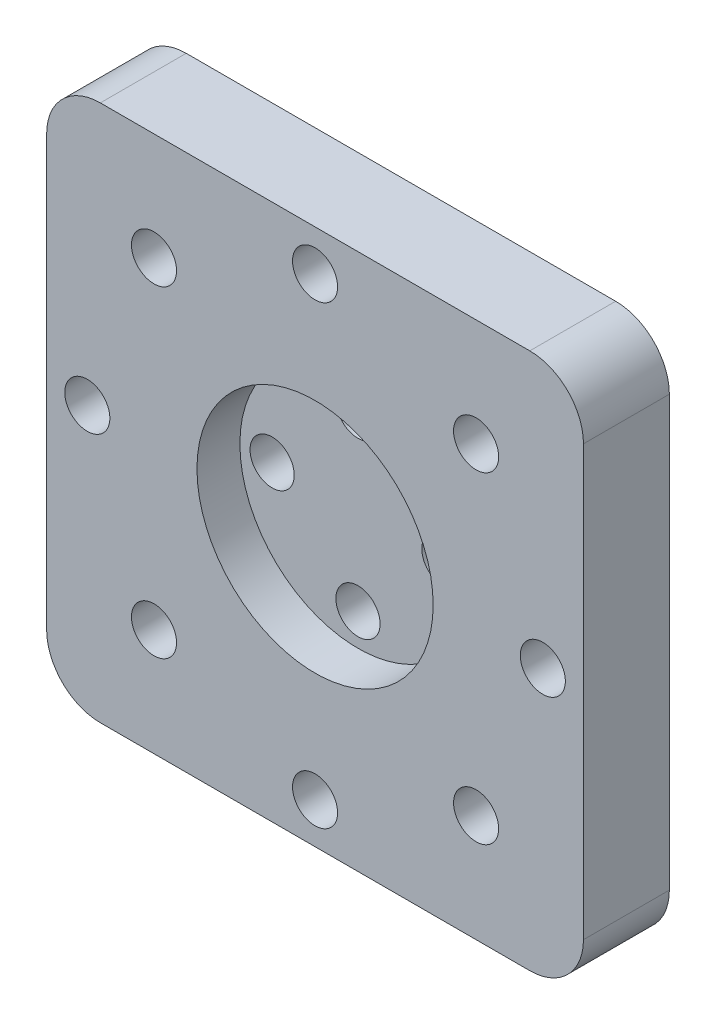
ISO-10303-21;
HEADER;
FILE_DESCRIPTION(('STEP AP214'),'2;1');
FILE_NAME('part.step','',(''),(''),'','','');
FILE_SCHEMA(('AUTOMOTIVE_DESIGN { 1 0 10303 214 1 1 1 1 }'));
ENDSEC;
DATA;
#1=APPLICATION_CONTEXT('core data for automotive mechanical design processes');
#2=APPLICATION_PROTOCOL_DEFINITION('international standard','automotive_design',2000,#1);
#3=PRODUCT_CONTEXT('',#1,'mechanical');
#4=PRODUCT('Part','Part','',(#3));
#5=PRODUCT_RELATED_PRODUCT_CATEGORY('part','',(#4));
#6=PRODUCT_DEFINITION_FORMATION('','',#4);
#7=PRODUCT_DEFINITION_CONTEXT('part definition',#1,'design');
#8=PRODUCT_DEFINITION('design','',#6,#7);
#9=PRODUCT_DEFINITION_SHAPE('','',#8);
#10=(LENGTH_UNIT() NAMED_UNIT(*) SI_UNIT(.MILLI.,.METRE.));
#11=(NAMED_UNIT(*) PLANE_ANGLE_UNIT() SI_UNIT($,.RADIAN.));
#12=(NAMED_UNIT(*) SI_UNIT($,.STERADIAN.) SOLID_ANGLE_UNIT());
#13=UNCERTAINTY_MEASURE_WITH_UNIT(LENGTH_MEASURE(1.E-05),#10,'distance_accuracy_value','');
#14=(GEOMETRIC_REPRESENTATION_CONTEXT(3) GLOBAL_UNCERTAINTY_ASSIGNED_CONTEXT((#13)) GLOBAL_UNIT_ASSIGNED_CONTEXT((#10,
#11,#12)) REPRESENTATION_CONTEXT('',''));
#15=CARTESIAN_POINT('',(0.,0.,0.));
#16=DIRECTION('',(0.,0.,1.));
#17=DIRECTION('',(1.,0.,0.));
#18=AXIS2_PLACEMENT_3D('',#15,#16,#17);
#19=CARTESIAN_POINT('',(7.99999999999999,0.,8.0000000000013));
#20=DIRECTION('',(0.,0.,-1.));
#21=DIRECTION('',(-1.,0.,0.));
#22=AXIS2_PLACEMENT_3D('',#19,#20,#21);
#23=CYLINDRICAL_SURFACE('',#22,2.05808124196885);
#24=CARTESIAN_POINT('',(7.99999999999999,0.,1.30451205393456E-12));
#25=DIRECTION('',(0.,0.,1.));
#26=DIRECTION('',(1.,0.,0.));
#27=AXIS2_PLACEMENT_3D('',#24,#25,#26);
#28=CIRCLE('',#27,2.05808124196885);
#29=CARTESIAN_POINT('',(10.0580812419688,0.,1.30451205393456E-12));
#30=VERTEX_POINT('',#29);
#31=EDGE_CURVE('E180',#30,#30,#28,.T.);
#32=ORIENTED_EDGE('',*,*,#31,.F.);
#33=EDGE_LOOP('',(#32));
#34=FACE_BOUND('',#33,.T.);
#35=CARTESIAN_POINT('',(7.99999999999999,0.,4.));
#36=DIRECTION('',(0.,0.,1.));
#37=DIRECTION('',(1.,0.,0.));
#38=AXIS2_PLACEMENT_3D('',#35,#36,#37);
#39=CIRCLE('',#38,2.05808124196885);
#40=CARTESIAN_POINT('',(10.0580812419688,0.,4.));
#41=VERTEX_POINT('',#40);
#42=EDGE_CURVE('E279',#41,#41,#39,.T.);
#43=ORIENTED_EDGE('',*,*,#42,.T.);
#44=EDGE_LOOP('',(#43));
#45=FACE_BOUND('',#44,.T.);
#46=ADVANCED_FACE('F45',(#34,#45),#23,.F.);
#47=CARTESIAN_POINT('',(0.,-8.00000000000001,8.0000000000013));
#48=DIRECTION('',(0.,0.,-1.));
#49=DIRECTION('',(-1.,0.,0.));
#50=AXIS2_PLACEMENT_3D('',#47,#48,#49);
#51=CYLINDRICAL_SURFACE('',#50,2.05808124196885);
#52=CARTESIAN_POINT('',(0.,-8.00000000000001,1.30451205393456E-12));
#53=DIRECTION('',(0.,0.,1.));
#54=DIRECTION('',(1.,0.,0.));
#55=AXIS2_PLACEMENT_3D('',#52,#53,#54);
#56=CIRCLE('',#55,2.05808124196885);
#57=CARTESIAN_POINT('',(2.05808124196884,-8.00000000000001,1.30451205393456E-12));
#58=VERTEX_POINT('',#57);
#59=EDGE_CURVE('E176',#58,#58,#56,.T.);
#60=ORIENTED_EDGE('',*,*,#59,.F.);
#61=EDGE_LOOP('',(#60));
#62=FACE_BOUND('',#61,.T.);
#63=CARTESIAN_POINT('',(0.,-8.00000000000001,4.));
#64=DIRECTION('',(0.,0.,1.));
#65=DIRECTION('',(1.,0.,0.));
#66=AXIS2_PLACEMENT_3D('',#63,#64,#65);
#67=CIRCLE('',#66,2.05808124196885);
#68=CARTESIAN_POINT('',(2.05808124196884,-8.00000000000001,4.));
#69=VERTEX_POINT('',#68);
#70=EDGE_CURVE('E301',#69,#69,#67,.T.);
#71=ORIENTED_EDGE('',*,*,#70,.T.);
#72=EDGE_LOOP('',(#71));
#73=FACE_BOUND('',#72,.T.);
#74=ADVANCED_FACE('F338',(#62,#73),#51,.F.);
#75=CARTESIAN_POINT('',(-8.00000000000001,0.,8.));
#76=DIRECTION('',(0.,0.,-1.));
#77=DIRECTION('',(-1.,0.,0.));
#78=AXIS2_PLACEMENT_3D('',#75,#76,#77);
#79=CYLINDRICAL_SURFACE('',#78,2.05808124196885);
#80=CARTESIAN_POINT('',(-8.00000000000001,0.,0.));
#81=DIRECTION('',(0.,0.,1.));
#82=DIRECTION('',(1.,0.,0.));
#83=AXIS2_PLACEMENT_3D('',#80,#81,#82);
#84=CIRCLE('',#83,2.05808124196885);
#85=CARTESIAN_POINT('',(-5.94191875803116,0.,0.));
#86=VERTEX_POINT('',#85);
#87=EDGE_CURVE('E172',#86,#86,#84,.T.);
#88=ORIENTED_EDGE('',*,*,#87,.F.);
#89=EDGE_LOOP('',(#88));
#90=FACE_BOUND('',#89,.T.);
#91=CARTESIAN_POINT('',(-8.00000000000001,0.,4.));
#92=DIRECTION('',(0.,0.,1.));
#93=DIRECTION('',(1.,0.,0.));
#94=AXIS2_PLACEMENT_3D('',#91,#92,#93);
#95=CIRCLE('',#94,2.05808124196885);
#96=CARTESIAN_POINT('',(-5.94191875803116,0.,4.));
#97=VERTEX_POINT('',#96);
#98=EDGE_CURVE('E305',#97,#97,#95,.T.);
#99=ORIENTED_EDGE('',*,*,#98,.T.);
#100=EDGE_LOOP('',(#99));
#101=FACE_BOUND('',#100,.T.);
#102=ADVANCED_FACE('F345',(#90,#101),#79,.F.);
#103=CARTESIAN_POINT('',(0.,8.,8.));
#104=DIRECTION('',(0.,0.,-1.));
#105=DIRECTION('',(-1.,0.,0.));
#106=AXIS2_PLACEMENT_3D('',#103,#104,#105);
#107=CYLINDRICAL_SURFACE('',#106,2.05808124196885);
#108=CARTESIAN_POINT('',(0.,8.,0.));
#109=DIRECTION('',(0.,0.,1.));
#110=DIRECTION('',(1.,0.,0.));
#111=AXIS2_PLACEMENT_3D('',#108,#109,#110);
#112=CIRCLE('',#111,2.05808124196885);
#113=CARTESIAN_POINT('',(2.05808124196885,8.,0.));
#114=VERTEX_POINT('',#113);
#115=EDGE_CURVE('E184',#114,#114,#112,.T.);
#116=ORIENTED_EDGE('',*,*,#115,.F.);
#117=EDGE_LOOP('',(#116));
#118=FACE_BOUND('',#117,.T.);
#119=CARTESIAN_POINT('',(0.,8.,4.));
#120=DIRECTION('',(0.,0.,1.));
#121=DIRECTION('',(1.,0.,0.));
#122=AXIS2_PLACEMENT_3D('',#119,#120,#121);
#123=CIRCLE('',#122,2.05808124196885);
#124=CARTESIAN_POINT('',(2.05808124196885,8.,4.));
#125=VERTEX_POINT('',#124);
#126=EDGE_CURVE('E49',#125,#125,#123,.T.);
#127=ORIENTED_EDGE('',*,*,#126,.T.);
#128=EDGE_LOOP('',(#127));
#129=FACE_BOUND('',#128,.T.);
#130=ADVANCED_FACE('F322',(#118,#129),#107,.F.);
#131=CARTESIAN_POINT('',(20.,20.,8.));
#132=DIRECTION('',(0.,0.,-1.));
#133=DIRECTION('',(-1.,0.,0.));
#134=AXIS2_PLACEMENT_3D('',#131,#132,#133);
#135=CYLINDRICAL_SURFACE('',#134,5.);
#136=CARTESIAN_POINT('',(20.,20.,0.));
#137=DIRECTION('',(0.,0.,1.));
#138=DIRECTION('',(1.,0.,0.));
#139=AXIS2_PLACEMENT_3D('',#136,#137,#138);
#140=CIRCLE('',#139,5.);
#141=CARTESIAN_POINT('',(20.,25.,0.));
#142=VERTEX_POINT('',#141);
#143=CARTESIAN_POINT('',(25.,20.,0.));
#144=VERTEX_POINT('',#143);
#145=EDGE_CURVE('E145',#142,#144,#140,.F.);
#146=ORIENTED_EDGE('',*,*,#145,.F.);
#147=DIRECTION('',(0.,0.,-1.));
#148=VECTOR('',#147,1.);
#149=CARTESIAN_POINT('',(20.,25.,8.));
#150=LINE('',#149,#148);
#151=CARTESIAN_POINT('',(20.,25.,8.));
#152=VERTEX_POINT('',#151);
#153=EDGE_CURVE('E11',#152,#142,#150,.T.);
#154=ORIENTED_EDGE('',*,*,#153,.F.);
#155=CARTESIAN_POINT('',(20.,20.,8.));
#156=DIRECTION('',(0.,0.,1.));
#157=DIRECTION('',(1.,0.,0.));
#158=AXIS2_PLACEMENT_3D('',#155,#156,#157);
#159=CIRCLE('',#158,5.);
#160=CARTESIAN_POINT('',(25.,20.,8.));
#161=VERTEX_POINT('',#160);
#162=EDGE_CURVE('E188',#152,#161,#159,.F.);
#163=ORIENTED_EDGE('',*,*,#162,.T.);
#164=DIRECTION('',(0.,0.,-1.));
#165=VECTOR('',#164,1.);
#166=CARTESIAN_POINT('',(25.,20.,8.));
#167=LINE('',#166,#165);
#168=EDGE_CURVE('E64',#161,#144,#167,.T.);
#169=ORIENTED_EDGE('',*,*,#168,.T.);
#170=EDGE_LOOP('',(#146,#154,#163,#169));
#171=FACE_BOUND('',#170,.T.);
#172=ADVANCED_FACE('F47',(#171),#135,.T.);
#173=CARTESIAN_POINT('',(0.,25.,8.));
#174=DIRECTION('',(0.,-1.,0.));
#175=DIRECTION('',(1.,0.,0.));
#176=AXIS2_PLACEMENT_3D('',#173,#174,#175);
#177=PLANE('',#176);
#178=DIRECTION('',(-1.,0.,0.));
#179=VECTOR('',#178,1.);
#180=CARTESIAN_POINT('',(0.,25.,0.));
#181=LINE('',#180,#179);
#182=CARTESIAN_POINT('',(-20.,25.,0.));
#183=VERTEX_POINT('',#182);
#184=EDGE_CURVE('E148',#142,#183,#181,.T.);
#185=ORIENTED_EDGE('',*,*,#184,.T.);
#186=DIRECTION('',(0.,0.,-1.));
#187=VECTOR('',#186,1.);
#188=CARTESIAN_POINT('',(-20.,25.,8.00000000000001));
#189=LINE('',#188,#187);
#190=CARTESIAN_POINT('',(-20.,25.,8.00000000000001));
#191=VERTEX_POINT('',#190);
#192=EDGE_CURVE('E56',#191,#183,#189,.T.);
#193=ORIENTED_EDGE('',*,*,#192,.F.);
#194=DIRECTION('',(-1.,0.,0.));
#195=VECTOR('',#194,1.);
#196=CARTESIAN_POINT('',(0.,25.,8.));
#197=LINE('',#196,#195);
#198=EDGE_CURVE('E227',#152,#191,#197,.T.);
#199=ORIENTED_EDGE('',*,*,#198,.F.);
#200=ORIENTED_EDGE('',*,*,#153,.T.);
#201=EDGE_LOOP('',(#185,#193,#199,#200));
#202=FACE_BOUND('',#201,.T.);
#203=ADVANCED_FACE('F370',(#202),#177,.F.);
#204=CARTESIAN_POINT('',(-20.,20.,8.00000000000001));
#205=DIRECTION('',(0.,0.,-1.));
#206=DIRECTION('',(-1.,0.,0.));
#207=AXIS2_PLACEMENT_3D('',#204,#205,#206);
#208=CYLINDRICAL_SURFACE('',#207,5.);
#209=CARTESIAN_POINT('',(-20.,20.,0.));
#210=DIRECTION('',(0.,0.,1.));
#211=DIRECTION('',(1.,0.,0.));
#212=AXIS2_PLACEMENT_3D('',#209,#210,#211);
#213=CIRCLE('',#212,5.);
#214=CARTESIAN_POINT('',(-25.,20.,0.));
#215=VERTEX_POINT('',#214);
#216=EDGE_CURVE('E152',#183,#215,#213,.T.);
#217=ORIENTED_EDGE('',*,*,#216,.T.);
#218=DIRECTION('',(0.,0.,-1.));
#219=VECTOR('',#218,1.);
#220=CARTESIAN_POINT('',(-25.,20.,8.00000000000001));
#221=LINE('',#220,#219);
#222=CARTESIAN_POINT('',(-25.,20.,8.00000000000001));
#223=VERTEX_POINT('',#222);
#224=EDGE_CURVE('E198',#223,#215,#221,.T.);
#225=ORIENTED_EDGE('',*,*,#224,.F.);
#226=CARTESIAN_POINT('',(-20.,20.,8.00000000000001));
#227=DIRECTION('',(0.,0.,1.));
#228=DIRECTION('',(1.,0.,0.));
#229=AXIS2_PLACEMENT_3D('',#226,#227,#228);
#230=CIRCLE('',#229,5.);
#231=EDGE_CURVE('E210',#191,#223,#230,.T.);
#232=ORIENTED_EDGE('',*,*,#231,.F.);
#233=ORIENTED_EDGE('',*,*,#192,.T.);
#234=EDGE_LOOP('',(#217,#225,#232,#233));
#235=FACE_BOUND('',#234,.T.);
#236=ADVANCED_FACE('F208',(#235),#208,.T.);
#237=CARTESIAN_POINT('',(-25.,0.,8.));
#238=DIRECTION('',(1.,0.,0.));
#239=DIRECTION('',(0.,1.,0.));
#240=AXIS2_PLACEMENT_3D('',#237,#238,#239);
#241=PLANE('',#240);
#242=DIRECTION('',(0.,-1.,0.));
#243=VECTOR('',#242,1.);
#244=CARTESIAN_POINT('',(-25.,0.,0.));
#245=LINE('',#244,#243);
#246=CARTESIAN_POINT('',(-25.,-20.,0.));
#247=VERTEX_POINT('',#246);
#248=EDGE_CURVE('E155',#215,#247,#245,.T.);
#249=ORIENTED_EDGE('',*,*,#248,.T.);
#250=DIRECTION('',(0.,0.,-1.));
#251=VECTOR('',#250,1.);
#252=CARTESIAN_POINT('',(-25.,-20.,8.00000000000001));
#253=LINE('',#252,#251);
#254=CARTESIAN_POINT('',(-25.,-20.,8.00000000000001));
#255=VERTEX_POINT('',#254);
#256=EDGE_CURVE('E195',#255,#247,#253,.T.);
#257=ORIENTED_EDGE('',*,*,#256,.F.);
#258=DIRECTION('',(0.,-1.,0.));
#259=VECTOR('',#258,1.);
#260=CARTESIAN_POINT('',(-25.,0.,8.));
#261=LINE('',#260,#259);
#262=EDGE_CURVE('E222',#223,#255,#261,.T.);
#263=ORIENTED_EDGE('',*,*,#262,.F.);
#264=ORIENTED_EDGE('',*,*,#224,.T.);
#265=EDGE_LOOP('',(#249,#257,#263,#264));
#266=FACE_BOUND('',#265,.T.);
#267=ADVANCED_FACE('F220',(#266),#241,.F.);
#268=CARTESIAN_POINT('',(-20.,-20.,8.00000000000001));
#269=DIRECTION('',(0.,0.,-1.));
#270=DIRECTION('',(-1.,0.,0.));
#271=AXIS2_PLACEMENT_3D('',#268,#269,#270);
#272=CYLINDRICAL_SURFACE('',#271,5.);
#273=CARTESIAN_POINT('',(-20.,-20.,0.));
#274=DIRECTION('',(0.,0.,1.));
#275=DIRECTION('',(1.,0.,0.));
#276=AXIS2_PLACEMENT_3D('',#273,#274,#275);
#277=CIRCLE('',#276,5.);
#278=CARTESIAN_POINT('',(-20.,-25.,0.));
#279=VERTEX_POINT('',#278);
#280=EDGE_CURVE('E159',#279,#247,#277,.F.);
#281=ORIENTED_EDGE('',*,*,#280,.F.);
#282=DIRECTION('',(0.,0.,-1.));
#283=VECTOR('',#282,1.);
#284=CARTESIAN_POINT('',(-20.,-25.,8.00000000000001));
#285=LINE('',#284,#283);
#286=CARTESIAN_POINT('',(-20.,-25.,8.00000000000001));
#287=VERTEX_POINT('',#286);
#288=EDGE_CURVE('E124',#287,#279,#285,.T.);
#289=ORIENTED_EDGE('',*,*,#288,.F.);
#290=CARTESIAN_POINT('',(-20.,-20.,8.00000000000001));
#291=DIRECTION('',(0.,0.,1.));
#292=DIRECTION('',(1.,0.,0.));
#293=AXIS2_PLACEMENT_3D('',#290,#291,#292);
#294=CIRCLE('',#293,5.);
#295=EDGE_CURVE('E134',#287,#255,#294,.F.);
#296=ORIENTED_EDGE('',*,*,#295,.T.);
#297=ORIENTED_EDGE('',*,*,#256,.T.);
#298=EDGE_LOOP('',(#281,#289,#296,#297));
#299=FACE_BOUND('',#298,.T.);
#300=ADVANCED_FACE('F363',(#299),#272,.T.);
#301=CARTESIAN_POINT('',(0.,-25.,8.00000000000001));
#302=DIRECTION('',(0.,-1.,0.));
#303=DIRECTION('',(1.,0.,0.));
#304=AXIS2_PLACEMENT_3D('',#301,#302,#303);
#305=PLANE('',#304);
#306=DIRECTION('',(-1.,0.,0.));
#307=VECTOR('',#306,1.);
#308=CARTESIAN_POINT('',(0.,-25.,0.));
#309=LINE('',#308,#307);
#310=CARTESIAN_POINT('',(20.,-25.,0.));
#311=VERTEX_POINT('',#310);
#312=EDGE_CURVE('E119',#311,#279,#309,.T.);
#313=ORIENTED_EDGE('',*,*,#312,.F.);
#314=DIRECTION('',(0.,0.,-1.));
#315=VECTOR('',#314,1.);
#316=CARTESIAN_POINT('',(20.,-25.,8.));
#317=LINE('',#316,#315);
#318=CARTESIAN_POINT('',(20.,-25.,8.));
#319=VERTEX_POINT('',#318);
#320=EDGE_CURVE('E114',#319,#311,#317,.T.);
#321=ORIENTED_EDGE('',*,*,#320,.F.);
#322=DIRECTION('',(-1.,0.,0.));
#323=VECTOR('',#322,1.);
#324=CARTESIAN_POINT('',(0.,-25.,8.00000000000001));
#325=LINE('',#324,#323);
#326=EDGE_CURVE('E117',#319,#287,#325,.T.);
#327=ORIENTED_EDGE('',*,*,#326,.T.);
#328=ORIENTED_EDGE('',*,*,#288,.T.);
#329=EDGE_LOOP('',(#313,#321,#327,#328));
#330=FACE_BOUND('',#329,.T.);
#331=ADVANCED_FACE('F116',(#330),#305,.T.);
#332=CARTESIAN_POINT('',(20.,-20.,8.));
#333=DIRECTION('',(0.,0.,-1.));
#334=DIRECTION('',(-1.,0.,0.));
#335=AXIS2_PLACEMENT_3D('',#332,#333,#334);
#336=CYLINDRICAL_SURFACE('',#335,5.);
#337=CARTESIAN_POINT('',(20.,-20.,0.));
#338=DIRECTION('',(0.,0.,1.));
#339=DIRECTION('',(1.,0.,0.));
#340=AXIS2_PLACEMENT_3D('',#337,#338,#339);
#341=CIRCLE('',#340,5.);
#342=CARTESIAN_POINT('',(25.,-20.,0.));
#343=VERTEX_POINT('',#342);
#344=EDGE_CURVE('E165',#343,#311,#341,.F.);
#345=ORIENTED_EDGE('',*,*,#344,.F.);
#346=DIRECTION('',(0.,0.,-1.));
#347=VECTOR('',#346,1.);
#348=CARTESIAN_POINT('',(25.,-20.,8.));
#349=LINE('',#348,#347);
#350=CARTESIAN_POINT('',(25.,-20.,8.));
#351=VERTEX_POINT('',#350);
#352=EDGE_CURVE('E89',#351,#343,#349,.T.);
#353=ORIENTED_EDGE('',*,*,#352,.F.);
#354=CARTESIAN_POINT('',(20.,-20.,8.));
#355=DIRECTION('',(0.,0.,1.));
#356=DIRECTION('',(1.,0.,0.));
#357=AXIS2_PLACEMENT_3D('',#354,#355,#356);
#358=CIRCLE('',#357,5.);
#359=EDGE_CURVE('E132',#351,#319,#358,.F.);
#360=ORIENTED_EDGE('',*,*,#359,.T.);
#361=ORIENTED_EDGE('',*,*,#320,.T.);
#362=EDGE_LOOP('',(#345,#353,#360,#361));
#363=FACE_BOUND('',#362,.T.);
#364=ADVANCED_FACE('F137',(#363),#336,.T.);
#365=CARTESIAN_POINT('',(25.,0.,8.00000000000001));
#366=DIRECTION('',(1.,0.,0.));
#367=DIRECTION('',(0.,1.,0.));
#368=AXIS2_PLACEMENT_3D('',#365,#366,#367);
#369=PLANE('',#368);
#370=DIRECTION('',(0.,-1.,0.));
#371=VECTOR('',#370,1.);
#372=CARTESIAN_POINT('',(25.,0.,0.));
#373=LINE('',#372,#371);
#374=EDGE_CURVE('E168',#144,#343,#373,.T.);
#375=ORIENTED_EDGE('',*,*,#374,.F.);
#376=ORIENTED_EDGE('',*,*,#168,.F.);
#377=DIRECTION('',(0.,-1.,0.));
#378=VECTOR('',#377,1.);
#379=CARTESIAN_POINT('',(25.,0.,8.00000000000001));
#380=LINE('',#379,#378);
#381=EDGE_CURVE('E139',#161,#351,#380,.T.);
#382=ORIENTED_EDGE('',*,*,#381,.T.);
#383=ORIENTED_EDGE('',*,*,#352,.T.);
#384=EDGE_LOOP('',(#375,#376,#382,#383));
#385=FACE_BOUND('',#384,.T.);
#386=ADVANCED_FACE('F356',(#385),#369,.T.);
#387=CARTESIAN_POINT('',(0.,0.,8.));
#388=DIRECTION('',(0.,0.,1.));
#389=DIRECTION('',(1.,0.,0.));
#390=AXIS2_PLACEMENT_3D('',#387,#388,#389);
#391=PLANE('',#390);
#392=CARTESIAN_POINT('',(0.,0.,8.));
#393=DIRECTION('',(0.,0.,1.));
#394=DIRECTION('',(1.,0.,0.));
#395=AXIS2_PLACEMENT_3D('',#392,#393,#394);
#396=CIRCLE('',#395,11.);
#397=CARTESIAN_POINT('',(11.,0.,8.));
#398=VERTEX_POINT('',#397);
#399=EDGE_CURVE('E309',#398,#398,#396,.T.);
#400=ORIENTED_EDGE('',*,*,#399,.F.);
#401=EDGE_LOOP('',(#400));
#402=FACE_BOUND('',#401,.T.);
#403=CARTESIAN_POINT('',(-15.,-15.,8.));
#404=DIRECTION('',(0.,0.,1.));
#405=DIRECTION('',(-1.,0.,0.));
#406=AXIS2_PLACEMENT_3D('',#403,#404,#405);
#407=CIRCLE('',#406,2.1);
#408=CARTESIAN_POINT('',(-17.1,-15.,8.));
#409=VERTEX_POINT('',#408);
#410=EDGE_CURVE('E238',#409,#409,#407,.T.);
#411=ORIENTED_EDGE('',*,*,#410,.F.);
#412=EDGE_LOOP('',(#411));
#413=FACE_BOUND('',#412,.T.);
#414=CARTESIAN_POINT('',(15.,-15.,8.));
#415=DIRECTION('',(0.,0.,1.));
#416=DIRECTION('',(1.,0.,0.));
#417=AXIS2_PLACEMENT_3D('',#414,#415,#416);
#418=CIRCLE('',#417,2.1);
#419=CARTESIAN_POINT('',(17.1,-15.,8.));
#420=VERTEX_POINT('',#419);
#421=EDGE_CURVE('E263',#420,#420,#418,.T.);
#422=ORIENTED_EDGE('',*,*,#421,.F.);
#423=EDGE_LOOP('',(#422));
#424=FACE_BOUND('',#423,.T.);
#425=CARTESIAN_POINT('',(15.,15.,8.));
#426=DIRECTION('',(0.,0.,1.));
#427=DIRECTION('',(-1.,0.,0.));
#428=AXIS2_PLACEMENT_3D('',#425,#426,#427);
#429=CIRCLE('',#428,2.1);
#430=CARTESIAN_POINT('',(12.9,15.,8.));
#431=VERTEX_POINT('',#430);
#432=EDGE_CURVE('E255',#431,#431,#429,.T.);
#433=ORIENTED_EDGE('',*,*,#432,.F.);
#434=EDGE_LOOP('',(#433));
#435=FACE_BOUND('',#434,.T.);
#436=CARTESIAN_POINT('',(1.7786357603738E-12,21.2132034355977,8.));
#437=DIRECTION('',(0.,0.,1.));
#438=DIRECTION('',(1.,0.,0.));
#439=AXIS2_PLACEMENT_3D('',#436,#437,#438);
#440=CIRCLE('',#439,2.09999999999903);
#441=CARTESIAN_POINT('',(2.10000000000081,21.2132034355977,8.));
#442=VERTEX_POINT('',#441);
#443=EDGE_CURVE('E246',#442,#442,#440,.T.);
#444=ORIENTED_EDGE('',*,*,#443,.F.);
#445=EDGE_LOOP('',(#444));
#446=FACE_BOUND('',#445,.T.);
#447=CARTESIAN_POINT('',(-21.2132034355935,0.,8.));
#448=DIRECTION('',(0.,0.,1.));
#449=DIRECTION('',(-1.,0.,0.));
#450=AXIS2_PLACEMENT_3D('',#447,#448,#449);
#451=CIRCLE('',#450,2.09999999999738);
#452=CARTESIAN_POINT('',(-23.3132034355908,0.,8.));
#453=VERTEX_POINT('',#452);
#454=EDGE_CURVE('E247',#453,#453,#451,.T.);
#455=ORIENTED_EDGE('',*,*,#454,.F.);
#456=EDGE_LOOP('',(#455));
#457=FACE_BOUND('',#456,.T.);
#458=CARTESIAN_POINT('',(4.15173747551007E-12,-21.2132034355952,8.));
#459=DIRECTION('',(0.,0.,1.));
#460=DIRECTION('',(1.,0.,0.));
#461=AXIS2_PLACEMENT_3D('',#458,#459,#460);
#462=CIRCLE('',#461,2.10000000000089);
#463=CARTESIAN_POINT('',(2.10000000000504,-21.2132034355952,8.));
#464=VERTEX_POINT('',#463);
#465=EDGE_CURVE('E287',#464,#464,#462,.T.);
#466=ORIENTED_EDGE('',*,*,#465,.F.);
#467=EDGE_LOOP('',(#466));
#468=FACE_BOUND('',#467,.T.);
#469=CARTESIAN_POINT('',(21.2132034355994,2.39994962190426E-12,8.));
#470=DIRECTION('',(0.,0.,1.));
#471=DIRECTION('',(-1.,0.,0.));
#472=AXIS2_PLACEMENT_3D('',#469,#470,#471);
#473=CIRCLE('',#472,2.09999999999925);
#474=CARTESIAN_POINT('',(19.1132034356001,2.39994962190426E-12,8.));
#475=VERTEX_POINT('',#474);
#476=EDGE_CURVE('E278',#475,#475,#473,.T.);
#477=ORIENTED_EDGE('',*,*,#476,.F.);
#478=EDGE_LOOP('',(#477));
#479=FACE_BOUND('',#478,.T.);
#480=CARTESIAN_POINT('',(-15.,15.,8.));
#481=DIRECTION('',(0.,0.,1.));
#482=DIRECTION('',(1.,0.,0.));
#483=AXIS2_PLACEMENT_3D('',#480,#481,#482);
#484=CIRCLE('',#483,2.1);
#485=CARTESIAN_POINT('',(-12.9,15.,8.));
#486=VERTEX_POINT('',#485);
#487=EDGE_CURVE('E234',#486,#486,#484,.T.);
#488=ORIENTED_EDGE('',*,*,#487,.F.);
#489=EDGE_LOOP('',(#488));
#490=FACE_BOUND('',#489,.T.);
#491=ORIENTED_EDGE('',*,*,#162,.F.);
#492=ORIENTED_EDGE('',*,*,#198,.T.);
#493=ORIENTED_EDGE('',*,*,#231,.T.);
#494=ORIENTED_EDGE('',*,*,#262,.T.);
#495=ORIENTED_EDGE('',*,*,#295,.F.);
#496=ORIENTED_EDGE('',*,*,#326,.F.);
#497=ORIENTED_EDGE('',*,*,#359,.F.);
#498=ORIENTED_EDGE('',*,*,#381,.F.);
#499=EDGE_LOOP('',(#491,#492,#493,#494,#495,#496,#497,#498));
#500=FACE_BOUND('',#499,.T.);
#501=ADVANCED_FACE('F130',(#402,#413,#424,#435,#446,#457,#468,#479,#490,#500),#391,.T.);
#502=CARTESIAN_POINT('',(0.,0.,0.));
#503=DIRECTION('',(0.,0.,1.));
#504=DIRECTION('',(1.,0.,0.));
#505=AXIS2_PLACEMENT_3D('',#502,#503,#504);
#506=PLANE('',#505);
#507=CARTESIAN_POINT('',(-15.,-15.,0.));
#508=DIRECTION('',(0.,0.,1.));
#509=DIRECTION('',(-1.,0.,0.));
#510=AXIS2_PLACEMENT_3D('',#507,#508,#509);
#511=CIRCLE('',#510,2.1);
#512=CARTESIAN_POINT('',(-17.1,-15.,0.));
#513=VERTEX_POINT('',#512);
#514=EDGE_CURVE('E267',#513,#513,#511,.T.);
#515=ORIENTED_EDGE('',*,*,#514,.T.);
#516=EDGE_LOOP('',(#515));
#517=FACE_BOUND('',#516,.T.);
#518=CARTESIAN_POINT('',(15.,-15.,0.));
#519=DIRECTION('',(0.,0.,1.));
#520=DIRECTION('',(1.,0.,0.));
#521=AXIS2_PLACEMENT_3D('',#518,#519,#520);
#522=CIRCLE('',#521,2.1);
#523=CARTESIAN_POINT('',(17.1,-15.,0.));
#524=VERTEX_POINT('',#523);
#525=EDGE_CURVE('E259',#524,#524,#522,.T.);
#526=ORIENTED_EDGE('',*,*,#525,.T.);
#527=EDGE_LOOP('',(#526));
#528=FACE_BOUND('',#527,.T.);
#529=CARTESIAN_POINT('',(15.,15.,0.));
#530=DIRECTION('',(0.,0.,1.));
#531=DIRECTION('',(-1.,0.,0.));
#532=AXIS2_PLACEMENT_3D('',#529,#530,#531);
#533=CIRCLE('',#532,2.1);
#534=CARTESIAN_POINT('',(12.9,15.,0.));
#535=VERTEX_POINT('',#534);
#536=EDGE_CURVE('E251',#535,#535,#533,.T.);
#537=ORIENTED_EDGE('',*,*,#536,.T.);
#538=EDGE_LOOP('',(#537));
#539=FACE_BOUND('',#538,.T.);
#540=CARTESIAN_POINT('',(1.7786357603738E-12,21.2132034355977,0.));
#541=DIRECTION('',(0.,0.,1.));
#542=DIRECTION('',(1.,0.,0.));
#543=AXIS2_PLACEMENT_3D('',#540,#541,#542);
#544=CIRCLE('',#543,2.09999999999903);
#545=CARTESIAN_POINT('',(2.10000000000081,21.2132034355977,0.));
#546=VERTEX_POINT('',#545);
#547=EDGE_CURVE('E242',#546,#546,#544,.T.);
#548=ORIENTED_EDGE('',*,*,#547,.T.);
#549=EDGE_LOOP('',(#548));
#550=FACE_BOUND('',#549,.T.);
#551=CARTESIAN_POINT('',(-21.2132034355935,0.,0.));
#552=DIRECTION('',(0.,0.,1.));
#553=DIRECTION('',(-1.,0.,0.));
#554=AXIS2_PLACEMENT_3D('',#551,#552,#553);
#555=CIRCLE('',#554,2.09999999999738);
#556=CARTESIAN_POINT('',(-23.3132034355908,0.,0.));
#557=VERTEX_POINT('',#556);
#558=EDGE_CURVE('E291',#557,#557,#555,.T.);
#559=ORIENTED_EDGE('',*,*,#558,.T.);
#560=EDGE_LOOP('',(#559));
#561=FACE_BOUND('',#560,.T.);
#562=CARTESIAN_POINT('',(4.15173747551007E-12,-21.2132034355952,0.));
#563=DIRECTION('',(0.,0.,1.));
#564=DIRECTION('',(1.,0.,0.));
#565=AXIS2_PLACEMENT_3D('',#562,#563,#564);
#566=CIRCLE('',#565,2.10000000000089);
#567=CARTESIAN_POINT('',(2.10000000000504,-21.2132034355952,0.));
#568=VERTEX_POINT('',#567);
#569=EDGE_CURVE('E283',#568,#568,#566,.T.);
#570=ORIENTED_EDGE('',*,*,#569,.T.);
#571=EDGE_LOOP('',(#570));
#572=FACE_BOUND('',#571,.T.);
#573=CARTESIAN_POINT('',(21.2132034355994,2.39994962190426E-12,0.));
#574=DIRECTION('',(0.,0.,1.));
#575=DIRECTION('',(-1.,0.,0.));
#576=AXIS2_PLACEMENT_3D('',#573,#574,#575);
#577=CIRCLE('',#576,2.09999999999925);
#578=CARTESIAN_POINT('',(19.1132034356001,2.39994962190426E-12,0.));
#579=VERTEX_POINT('',#578);
#580=EDGE_CURVE('E274',#579,#579,#577,.T.);
#581=ORIENTED_EDGE('',*,*,#580,.T.);
#582=EDGE_LOOP('',(#581));
#583=FACE_BOUND('',#582,.T.);
#584=CARTESIAN_POINT('',(-15.,15.,0.));
#585=DIRECTION('',(0.,0.,1.));
#586=DIRECTION('',(1.,0.,0.));
#587=AXIS2_PLACEMENT_3D('',#584,#585,#586);
#588=CIRCLE('',#587,2.1);
#589=CARTESIAN_POINT('',(-12.9,15.,0.));
#590=VERTEX_POINT('',#589);
#591=EDGE_CURVE('E149',#590,#590,#588,.T.);
#592=ORIENTED_EDGE('',*,*,#591,.T.);
#593=EDGE_LOOP('',(#592));
#594=FACE_BOUND('',#593,.T.);
#595=ORIENTED_EDGE('',*,*,#145,.T.);
#596=ORIENTED_EDGE('',*,*,#374,.T.);
#597=ORIENTED_EDGE('',*,*,#344,.T.);
#598=ORIENTED_EDGE('',*,*,#312,.T.);
#599=ORIENTED_EDGE('',*,*,#280,.T.);
#600=ORIENTED_EDGE('',*,*,#248,.F.);
#601=ORIENTED_EDGE('',*,*,#216,.F.);
#602=ORIENTED_EDGE('',*,*,#184,.F.);
#603=EDGE_LOOP('',(#595,#596,#597,#598,#599,#600,#601,#602));
#604=FACE_BOUND('',#603,.T.);
#605=ORIENTED_EDGE('',*,*,#87,.T.);
#606=EDGE_LOOP('',(#605));
#607=FACE_BOUND('',#606,.T.);
#608=ORIENTED_EDGE('',*,*,#59,.T.);
#609=EDGE_LOOP('',(#608));
#610=FACE_BOUND('',#609,.T.);
#611=ORIENTED_EDGE('',*,*,#31,.T.);
#612=EDGE_LOOP('',(#611));
#613=FACE_BOUND('',#612,.T.);
#614=ORIENTED_EDGE('',*,*,#115,.T.);
#615=EDGE_LOOP('',(#614));
#616=FACE_BOUND('',#615,.T.);
#617=ADVANCED_FACE('F215',(#517,#528,#539,#550,#561,#572,#583,#594,#604,#607,#610,#613,#616),
#506,.F.);
#618=CARTESIAN_POINT('',(-15.,15.,0.));
#619=DIRECTION('',(0.,0.,1.));
#620=DIRECTION('',(1.,0.,0.));
#621=AXIS2_PLACEMENT_3D('',#618,#619,#620);
#622=CYLINDRICAL_SURFACE('',#621,2.1);
#623=ORIENTED_EDGE('',*,*,#591,.F.);
#624=EDGE_LOOP('',(#623));
#625=FACE_BOUND('',#624,.T.);
#626=ORIENTED_EDGE('',*,*,#487,.T.);
#627=EDGE_LOOP('',(#626));
#628=FACE_BOUND('',#627,.T.);
#629=ADVANCED_FACE('F385',(#625,#628),#622,.F.);
#630=CARTESIAN_POINT('',(21.2132034355994,2.39994962190426E-12,0.));
#631=DIRECTION('',(0.,0.,1.));
#632=DIRECTION('',(1.,0.,0.));
#633=AXIS2_PLACEMENT_3D('',#630,#631,#632);
#634=CYLINDRICAL_SURFACE('',#633,2.09999999999925);
#635=ORIENTED_EDGE('',*,*,#580,.F.);
#636=EDGE_LOOP('',(#635));
#637=FACE_BOUND('',#636,.T.);
#638=ORIENTED_EDGE('',*,*,#476,.T.);
#639=EDGE_LOOP('',(#638));
#640=FACE_BOUND('',#639,.T.);
#641=ADVANCED_FACE('F390',(#637,#640),#634,.F.);
#642=CARTESIAN_POINT('',(4.15173747551007E-12,-21.2132034355952,0.));
#643=DIRECTION('',(0.,0.,1.));
#644=DIRECTION('',(1.,0.,0.));
#645=AXIS2_PLACEMENT_3D('',#642,#643,#644);
#646=CYLINDRICAL_SURFACE('',#645,2.10000000000089);
#647=ORIENTED_EDGE('',*,*,#569,.F.);
#648=EDGE_LOOP('',(#647));
#649=FACE_BOUND('',#648,.T.);
#650=ORIENTED_EDGE('',*,*,#465,.T.);
#651=EDGE_LOOP('',(#650));
#652=FACE_BOUND('',#651,.T.);
#653=ADVANCED_FACE('F414',(#649,#652),#646,.F.);
#654=CARTESIAN_POINT('',(-21.2132034355935,0.,0.));
#655=DIRECTION('',(0.,0.,1.));
#656=DIRECTION('',(1.,0.,0.));
#657=AXIS2_PLACEMENT_3D('',#654,#655,#656);
#658=CYLINDRICAL_SURFACE('',#657,2.09999999999738);
#659=ORIENTED_EDGE('',*,*,#558,.F.);
#660=EDGE_LOOP('',(#659));
#661=FACE_BOUND('',#660,.T.);
#662=ORIENTED_EDGE('',*,*,#454,.T.);
#663=EDGE_LOOP('',(#662));
#664=FACE_BOUND('',#663,.T.);
#665=ADVANCED_FACE('F401',(#661,#664),#658,.F.);
#666=CARTESIAN_POINT('',(1.7786357603738E-12,21.2132034355977,0.));
#667=DIRECTION('',(0.,0.,1.));
#668=DIRECTION('',(1.,0.,0.));
#669=AXIS2_PLACEMENT_3D('',#666,#667,#668);
#670=CYLINDRICAL_SURFACE('',#669,2.09999999999903);
#671=ORIENTED_EDGE('',*,*,#547,.F.);
#672=EDGE_LOOP('',(#671));
#673=FACE_BOUND('',#672,.T.);
#674=ORIENTED_EDGE('',*,*,#443,.T.);
#675=EDGE_LOOP('',(#674));
#676=FACE_BOUND('',#675,.T.);
#677=ADVANCED_FACE('F397',(#673,#676),#670,.F.);
#678=CARTESIAN_POINT('',(15.,15.,0.));
#679=DIRECTION('',(0.,0.,1.));
#680=DIRECTION('',(1.,0.,0.));
#681=AXIS2_PLACEMENT_3D('',#678,#679,#680);
#682=CYLINDRICAL_SURFACE('',#681,2.1);
#683=ORIENTED_EDGE('',*,*,#536,.F.);
#684=EDGE_LOOP('',(#683));
#685=FACE_BOUND('',#684,.T.);
#686=ORIENTED_EDGE('',*,*,#432,.T.);
#687=EDGE_LOOP('',(#686));
#688=FACE_BOUND('',#687,.T.);
#689=ADVANCED_FACE('F400',(#685,#688),#682,.F.);
#690=CARTESIAN_POINT('',(15.,-15.,0.));
#691=DIRECTION('',(0.,0.,1.));
#692=DIRECTION('',(1.,0.,0.));
#693=AXIS2_PLACEMENT_3D('',#690,#691,#692);
#694=CYLINDRICAL_SURFACE('',#693,2.1);
#695=ORIENTED_EDGE('',*,*,#525,.F.);
#696=EDGE_LOOP('',(#695));
#697=FACE_BOUND('',#696,.T.);
#698=ORIENTED_EDGE('',*,*,#421,.T.);
#699=EDGE_LOOP('',(#698));
#700=FACE_BOUND('',#699,.T.);
#701=ADVANCED_FACE('F405',(#697,#700),#694,.F.);
#702=CARTESIAN_POINT('',(-15.,-15.,0.));
#703=DIRECTION('',(0.,0.,1.));
#704=DIRECTION('',(1.,0.,0.));
#705=AXIS2_PLACEMENT_3D('',#702,#703,#704);
#706=CYLINDRICAL_SURFACE('',#705,2.1);
#707=ORIENTED_EDGE('',*,*,#514,.F.);
#708=EDGE_LOOP('',(#707));
#709=FACE_BOUND('',#708,.T.);
#710=ORIENTED_EDGE('',*,*,#410,.T.);
#711=EDGE_LOOP('',(#710));
#712=FACE_BOUND('',#711,.T.);
#713=ADVANCED_FACE('F332',(#709,#712),#706,.F.);
#714=CARTESIAN_POINT('',(0.,0.,4.));
#715=DIRECTION('',(0.,0.,1.));
#716=DIRECTION('',(1.,0.,0.));
#717=AXIS2_PLACEMENT_3D('',#714,#715,#716);
#718=CYLINDRICAL_SURFACE('',#717,11.);
#719=CARTESIAN_POINT('',(0.,0.,4.));
#720=DIRECTION('',(0.,0.,1.));
#721=DIRECTION('',(1.,0.,0.));
#722=AXIS2_PLACEMENT_3D('',#719,#720,#721);
#723=CIRCLE('',#722,11.);
#724=CARTESIAN_POINT('',(11.,0.,4.));
#725=VERTEX_POINT('',#724);
#726=EDGE_CURVE('E313',#725,#725,#723,.T.);
#727=ORIENTED_EDGE('',*,*,#726,.F.);
#728=EDGE_LOOP('',(#727));
#729=FACE_BOUND('',#728,.T.);
#730=ORIENTED_EDGE('',*,*,#399,.T.);
#731=EDGE_LOOP('',(#730));
#732=FACE_BOUND('',#731,.T.);
#733=ADVANCED_FACE('F326',(#729,#732),#718,.F.);
#734=CARTESIAN_POINT('',(0.,0.,4.));
#735=DIRECTION('',(0.,0.,1.));
#736=DIRECTION('',(1.,0.,0.));
#737=AXIS2_PLACEMENT_3D('',#734,#735,#736);
#738=PLANE('',#737);
#739=ORIENTED_EDGE('',*,*,#42,.F.);
#740=EDGE_LOOP('',(#739));
#741=FACE_BOUND('',#740,.T.);
#742=ORIENTED_EDGE('',*,*,#70,.F.);
#743=EDGE_LOOP('',(#742));
#744=FACE_BOUND('',#743,.T.);
#745=ORIENTED_EDGE('',*,*,#98,.F.);
#746=EDGE_LOOP('',(#745));
#747=FACE_BOUND('',#746,.T.);
#748=ORIENTED_EDGE('',*,*,#126,.F.);
#749=EDGE_LOOP('',(#748));
#750=FACE_BOUND('',#749,.T.);
#751=ORIENTED_EDGE('',*,*,#726,.T.);
#752=EDGE_LOOP('',(#751));
#753=FACE_BOUND('',#752,.T.);
#754=ADVANCED_FACE('F324',(#741,#744,#747,#750,#753),#738,.T.);
#755=CLOSED_SHELL('',(#46,#74,#102,#130,#172,#203,#236,#267,#300,#331,#364,#386,#501,#617,#629,
#641,#653,#665,#677,#689,#701,#713,#733,#754));
#756=MANIFOLD_SOLID_BREP('B2',#755);
#757=ADVANCED_BREP_SHAPE_REPRESENTATION('',(#18,#756),#14);
#758=SHAPE_DEFINITION_REPRESENTATION(#9,#757);
ENDSEC;
END-ISO-10303-21;
